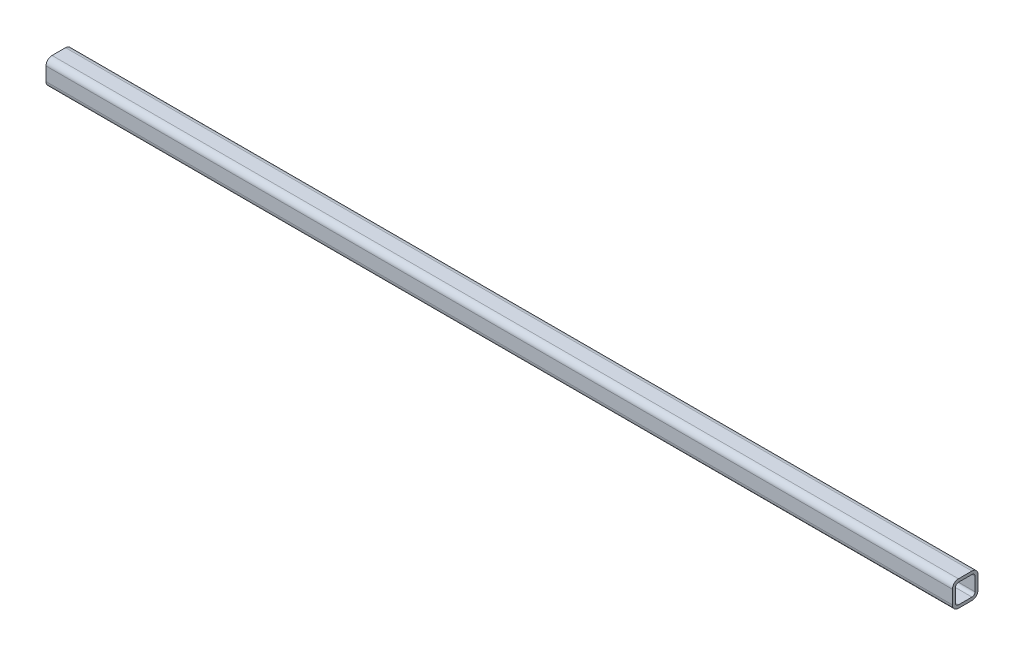
ISO-10303-21;
HEADER;
FILE_DESCRIPTION(('STEP AP214'),'2;1');
FILE_NAME('part.step','',(''),(''),'','','');
FILE_SCHEMA(('AUTOMOTIVE_DESIGN { 1 0 10303 214 1 1 1 1 }'));
ENDSEC;
DATA;
#1=APPLICATION_CONTEXT('core data for automotive mechanical design processes');
#2=APPLICATION_PROTOCOL_DEFINITION('international standard','automotive_design',2000,#1);
#3=PRODUCT_CONTEXT('',#1,'mechanical');
#4=PRODUCT('Part','Part','',(#3));
#5=PRODUCT_RELATED_PRODUCT_CATEGORY('part','',(#4));
#6=PRODUCT_DEFINITION_FORMATION('','',#4);
#7=PRODUCT_DEFINITION_CONTEXT('part definition',#1,'design');
#8=PRODUCT_DEFINITION('design','',#6,#7);
#9=PRODUCT_DEFINITION_SHAPE('','',#8);
#10=(LENGTH_UNIT() NAMED_UNIT(*) SI_UNIT(.MILLI.,.METRE.));
#11=(NAMED_UNIT(*) PLANE_ANGLE_UNIT() SI_UNIT($,.RADIAN.));
#12=(NAMED_UNIT(*) SI_UNIT($,.STERADIAN.) SOLID_ANGLE_UNIT());
#13=UNCERTAINTY_MEASURE_WITH_UNIT(LENGTH_MEASURE(1.E-05),#10,'distance_accuracy_value','');
#14=(GEOMETRIC_REPRESENTATION_CONTEXT(3) GLOBAL_UNCERTAINTY_ASSIGNED_CONTEXT((#13)) GLOBAL_UNIT_ASSIGNED_CONTEXT((#10,
#11,#12)) REPRESENTATION_CONTEXT('',''));
#15=CARTESIAN_POINT('',(0.,0.,0.));
#16=DIRECTION('',(0.,0.,1.));
#17=DIRECTION('',(1.,0.,0.));
#18=AXIS2_PLACEMENT_3D('',#15,#16,#17);
#19=CARTESIAN_POINT('',(900.,6.7,-6.7));
#20=DIRECTION('',(-1.,0.,0.));
#21=DIRECTION('',(0.,0.,1.));
#22=AXIS2_PLACEMENT_3D('',#19,#20,#21);
#23=CYLINDRICAL_SURFACE('',#22,6.);
#24=CARTESIAN_POINT('',(0.,6.7,-6.7));
#25=DIRECTION('',(1.,0.,0.));
#26=DIRECTION('',(0.,0.,-1.));
#27=AXIS2_PLACEMENT_3D('',#24,#25,#26);
#28=CIRCLE('',#27,6.);
#29=CARTESIAN_POINT('',(0.,6.7,-12.7));
#30=VERTEX_POINT('',#29);
#31=CARTESIAN_POINT('',(0.,12.7,-6.7));
#32=VERTEX_POINT('',#31);
#33=EDGE_CURVE('E234',#30,#32,#28,.T.);
#34=ORIENTED_EDGE('',*,*,#33,.T.);
#35=DIRECTION('',(-1.,0.,0.));
#36=VECTOR('',#35,1.);
#37=CARTESIAN_POINT('',(900.,12.7,-6.7));
#38=LINE('',#37,#36);
#39=CARTESIAN_POINT('',(900.,12.7,-6.7));
#40=VERTEX_POINT('',#39);
#41=EDGE_CURVE('E12',#40,#32,#38,.T.);
#42=ORIENTED_EDGE('',*,*,#41,.F.);
#43=CARTESIAN_POINT('',(900.,6.7,-6.7));
#44=DIRECTION('',(1.,0.,0.));
#45=DIRECTION('',(0.,0.,-1.));
#46=AXIS2_PLACEMENT_3D('',#43,#44,#45);
#47=CIRCLE('',#46,6.);
#48=CARTESIAN_POINT('',(900.,6.7,-12.7));
#49=VERTEX_POINT('',#48);
#50=EDGE_CURVE('E312',#49,#40,#47,.T.);
#51=ORIENTED_EDGE('',*,*,#50,.F.);
#52=DIRECTION('',(-1.,0.,0.));
#53=VECTOR('',#52,1.);
#54=CARTESIAN_POINT('',(900.,6.7,-12.7));
#55=LINE('',#54,#53);
#56=EDGE_CURVE('E249',#49,#30,#55,.T.);
#57=ORIENTED_EDGE('',*,*,#56,.T.);
#58=EDGE_LOOP('',(#34,#42,#51,#57));
#59=FACE_BOUND('',#58,.T.);
#60=ADVANCED_FACE('F62',(#59),#23,.T.);
#61=CARTESIAN_POINT('',(900.,12.7,-6.7));
#62=DIRECTION('',(0.,-1.,0.));
#63=DIRECTION('',(0.,0.,-1.));
#64=AXIS2_PLACEMENT_3D('',#61,#62,#63);
#65=PLANE('',#64);
#66=DIRECTION('',(0.,0.,1.));
#67=VECTOR('',#66,1.);
#68=CARTESIAN_POINT('',(0.,12.7,-6.7));
#69=LINE('',#68,#67);
#70=CARTESIAN_POINT('',(0.,12.7,6.7));
#71=VERTEX_POINT('',#70);
#72=EDGE_CURVE('E237',#32,#71,#69,.T.);
#73=ORIENTED_EDGE('',*,*,#72,.T.);
#74=DIRECTION('',(-1.,0.,0.));
#75=VECTOR('',#74,1.);
#76=CARTESIAN_POINT('',(900.,12.7,6.7));
#77=LINE('',#76,#75);
#78=CARTESIAN_POINT('',(900.,12.7,6.7));
#79=VERTEX_POINT('',#78);
#80=EDGE_CURVE('E72',#79,#71,#77,.T.);
#81=ORIENTED_EDGE('',*,*,#80,.F.);
#82=DIRECTION('',(0.,0.,1.));
#83=VECTOR('',#82,1.);
#84=CARTESIAN_POINT('',(900.,12.7,-6.7));
#85=LINE('',#84,#83);
#86=EDGE_CURVE('E314',#40,#79,#85,.T.);
#87=ORIENTED_EDGE('',*,*,#86,.F.);
#88=ORIENTED_EDGE('',*,*,#41,.T.);
#89=EDGE_LOOP('',(#73,#81,#87,#88));
#90=FACE_BOUND('',#89,.T.);
#91=ADVANCED_FACE('F349',(#90),#65,.F.);
#92=CARTESIAN_POINT('',(900.,6.7,6.7));
#93=DIRECTION('',(-1.,0.,0.));
#94=DIRECTION('',(0.,0.,1.));
#95=AXIS2_PLACEMENT_3D('',#92,#93,#94);
#96=CYLINDRICAL_SURFACE('',#95,6.);
#97=CARTESIAN_POINT('',(0.,6.7,6.7));
#98=DIRECTION('',(1.,0.,0.));
#99=DIRECTION('',(0.,0.,-1.));
#100=AXIS2_PLACEMENT_3D('',#97,#98,#99);
#101=CIRCLE('',#100,6.);
#102=CARTESIAN_POINT('',(0.,6.7,12.7));
#103=VERTEX_POINT('',#102);
#104=EDGE_CURVE('E239',#71,#103,#101,.T.);
#105=ORIENTED_EDGE('',*,*,#104,.T.);
#106=DIRECTION('',(-1.,0.,0.));
#107=VECTOR('',#106,1.);
#108=CARTESIAN_POINT('',(900.,6.7,12.7));
#109=LINE('',#108,#107);
#110=CARTESIAN_POINT('',(900.,6.7,12.7));
#111=VERTEX_POINT('',#110);
#112=EDGE_CURVE('E256',#111,#103,#109,.T.);
#113=ORIENTED_EDGE('',*,*,#112,.F.);
#114=CARTESIAN_POINT('',(900.,6.7,6.7));
#115=DIRECTION('',(1.,0.,0.));
#116=DIRECTION('',(0.,0.,-1.));
#117=AXIS2_PLACEMENT_3D('',#114,#115,#116);
#118=CIRCLE('',#117,6.);
#119=EDGE_CURVE('E316',#79,#111,#118,.T.);
#120=ORIENTED_EDGE('',*,*,#119,.F.);
#121=ORIENTED_EDGE('',*,*,#80,.T.);
#122=EDGE_LOOP('',(#105,#113,#120,#121));
#123=FACE_BOUND('',#122,.T.);
#124=ADVANCED_FACE('F354',(#123),#96,.T.);
#125=CARTESIAN_POINT('',(900.,-6.7,12.7));
#126=DIRECTION('',(0.,0.,-1.));
#127=DIRECTION('',(-1.,0.,0.));
#128=AXIS2_PLACEMENT_3D('',#125,#126,#127);
#129=PLANE('',#128);
#130=DIRECTION('',(0.,-1.,0.));
#131=VECTOR('',#130,1.);
#132=CARTESIAN_POINT('',(0.,-6.7,12.7));
#133=LINE('',#132,#131);
#134=CARTESIAN_POINT('',(0.,-6.7,12.7));
#135=VERTEX_POINT('',#134);
#136=EDGE_CURVE('E241',#103,#135,#133,.T.);
#137=ORIENTED_EDGE('',*,*,#136,.T.);
#138=DIRECTION('',(-1.,0.,0.));
#139=VECTOR('',#138,1.);
#140=CARTESIAN_POINT('',(900.,-6.7,12.7));
#141=LINE('',#140,#139);
#142=CARTESIAN_POINT('',(900.,-6.7,12.7));
#143=VERTEX_POINT('',#142);
#144=EDGE_CURVE('E253',#143,#135,#141,.T.);
#145=ORIENTED_EDGE('',*,*,#144,.F.);
#146=DIRECTION('',(0.,-1.,0.));
#147=VECTOR('',#146,1.);
#148=CARTESIAN_POINT('',(900.,-6.7,12.7));
#149=LINE('',#148,#147);
#150=EDGE_CURVE('E318',#111,#143,#149,.T.);
#151=ORIENTED_EDGE('',*,*,#150,.F.);
#152=ORIENTED_EDGE('',*,*,#112,.T.);
#153=EDGE_LOOP('',(#137,#145,#151,#152));
#154=FACE_BOUND('',#153,.T.);
#155=ADVANCED_FACE('F324',(#154),#129,.F.);
#156=CARTESIAN_POINT('',(900.,-6.7,6.7));
#157=DIRECTION('',(-1.,0.,0.));
#158=DIRECTION('',(0.,0.,1.));
#159=AXIS2_PLACEMENT_3D('',#156,#157,#158);
#160=CYLINDRICAL_SURFACE('',#159,6.);
#161=CARTESIAN_POINT('',(0.,-6.7,6.7));
#162=DIRECTION('',(1.,0.,0.));
#163=DIRECTION('',(0.,0.,-1.));
#164=AXIS2_PLACEMENT_3D('',#161,#162,#163);
#165=CIRCLE('',#164,6.);
#166=CARTESIAN_POINT('',(0.,-12.7,6.7));
#167=VERTEX_POINT('',#166);
#168=EDGE_CURVE('E243',#135,#167,#165,.T.);
#169=ORIENTED_EDGE('',*,*,#168,.T.);
#170=DIRECTION('',(-1.,0.,0.));
#171=VECTOR('',#170,1.);
#172=CARTESIAN_POINT('',(900.,-12.7,6.7));
#173=LINE('',#172,#171);
#174=CARTESIAN_POINT('',(900.,-12.7,6.7));
#175=VERTEX_POINT('',#174);
#176=EDGE_CURVE('E201',#175,#167,#173,.T.);
#177=ORIENTED_EDGE('',*,*,#176,.F.);
#178=CARTESIAN_POINT('',(900.,-6.7,6.7));
#179=DIRECTION('',(1.,0.,0.));
#180=DIRECTION('',(0.,0.,-1.));
#181=AXIS2_PLACEMENT_3D('',#178,#179,#180);
#182=CIRCLE('',#181,6.);
#183=EDGE_CURVE('E192',#143,#175,#182,.T.);
#184=ORIENTED_EDGE('',*,*,#183,.F.);
#185=ORIENTED_EDGE('',*,*,#144,.T.);
#186=EDGE_LOOP('',(#169,#177,#184,#185));
#187=FACE_BOUND('',#186,.T.);
#188=ADVANCED_FACE('F328',(#187),#160,.T.);
#189=CARTESIAN_POINT('',(900.,-12.7,6.7));
#190=DIRECTION('',(0.,1.,0.));
#191=DIRECTION('',(0.,0.,1.));
#192=AXIS2_PLACEMENT_3D('',#189,#190,#191);
#193=PLANE('',#192);
#194=DIRECTION('',(0.,0.,-1.));
#195=VECTOR('',#194,1.);
#196=CARTESIAN_POINT('',(0.,-12.7,6.7));
#197=LINE('',#196,#195);
#198=CARTESIAN_POINT('',(0.,-12.7,-6.7));
#199=VERTEX_POINT('',#198);
#200=EDGE_CURVE('E200',#167,#199,#197,.T.);
#201=ORIENTED_EDGE('',*,*,#200,.T.);
#202=DIRECTION('',(-1.,0.,0.));
#203=VECTOR('',#202,1.);
#204=CARTESIAN_POINT('',(900.,-12.7,-6.7));
#205=LINE('',#204,#203);
#206=CARTESIAN_POINT('',(900.,-12.7,-6.7));
#207=VERTEX_POINT('',#206);
#208=EDGE_CURVE('E197',#207,#199,#205,.T.);
#209=ORIENTED_EDGE('',*,*,#208,.F.);
#210=DIRECTION('',(0.,0.,-1.));
#211=VECTOR('',#210,1.);
#212=CARTESIAN_POINT('',(900.,-12.7,6.7));
#213=LINE('',#212,#211);
#214=EDGE_CURVE('E186',#175,#207,#213,.T.);
#215=ORIENTED_EDGE('',*,*,#214,.F.);
#216=ORIENTED_EDGE('',*,*,#176,.T.);
#217=EDGE_LOOP('',(#201,#209,#215,#216));
#218=FACE_BOUND('',#217,.T.);
#219=ADVANCED_FACE('F198',(#218),#193,.F.);
#220=CARTESIAN_POINT('',(900.,-6.7,-6.7));
#221=DIRECTION('',(-1.,0.,0.));
#222=DIRECTION('',(0.,0.,1.));
#223=AXIS2_PLACEMENT_3D('',#220,#221,#222);
#224=CYLINDRICAL_SURFACE('',#223,6.);
#225=CARTESIAN_POINT('',(0.,-6.7,-6.7));
#226=DIRECTION('',(1.,0.,0.));
#227=DIRECTION('',(0.,0.,-1.));
#228=AXIS2_PLACEMENT_3D('',#225,#226,#227);
#229=CIRCLE('',#228,6.);
#230=CARTESIAN_POINT('',(0.,-6.7,-12.7));
#231=VERTEX_POINT('',#230);
#232=EDGE_CURVE('E134',#199,#231,#229,.T.);
#233=ORIENTED_EDGE('',*,*,#232,.T.);
#234=DIRECTION('',(-1.,0.,0.));
#235=VECTOR('',#234,1.);
#236=CARTESIAN_POINT('',(900.,-6.7,-12.7));
#237=LINE('',#236,#235);
#238=CARTESIAN_POINT('',(900.,-6.7,-12.7));
#239=VERTEX_POINT('',#238);
#240=EDGE_CURVE('E202',#239,#231,#237,.T.);
#241=ORIENTED_EDGE('',*,*,#240,.F.);
#242=CARTESIAN_POINT('',(900.,-6.7,-6.7));
#243=DIRECTION('',(1.,0.,0.));
#244=DIRECTION('',(0.,0.,-1.));
#245=AXIS2_PLACEMENT_3D('',#242,#243,#244);
#246=CIRCLE('',#245,6.);
#247=EDGE_CURVE('E190',#207,#239,#246,.T.);
#248=ORIENTED_EDGE('',*,*,#247,.F.);
#249=ORIENTED_EDGE('',*,*,#208,.T.);
#250=EDGE_LOOP('',(#233,#241,#248,#249));
#251=FACE_BOUND('',#250,.T.);
#252=ADVANCED_FACE('F204',(#251),#224,.T.);
#253=CARTESIAN_POINT('',(900.,6.7,6.7));
#254=DIRECTION('',(-1.,0.,0.));
#255=DIRECTION('',(0.,0.,1.));
#256=AXIS2_PLACEMENT_3D('',#253,#254,#255);
#257=CYLINDRICAL_SURFACE('',#256,3.);
#258=CARTESIAN_POINT('',(0.,6.7,6.7));
#259=DIRECTION('',(1.,0.,0.));
#260=DIRECTION('',(0.,0.,-1.));
#261=AXIS2_PLACEMENT_3D('',#258,#259,#260);
#262=CIRCLE('',#261,3.);
#263=CARTESIAN_POINT('',(0.,9.7,6.7));
#264=VERTEX_POINT('',#263);
#265=CARTESIAN_POINT('',(0.,6.7,9.7));
#266=VERTEX_POINT('',#265);
#267=EDGE_CURVE('E210',#264,#266,#262,.T.);
#268=ORIENTED_EDGE('',*,*,#267,.F.);
#269=DIRECTION('',(-1.,0.,0.));
#270=VECTOR('',#269,1.);
#271=CARTESIAN_POINT('',(900.,9.7,6.7));
#272=LINE('',#271,#270);
#273=CARTESIAN_POINT('',(900.,9.7,6.7));
#274=VERTEX_POINT('',#273);
#275=EDGE_CURVE('E66',#274,#264,#272,.T.);
#276=ORIENTED_EDGE('',*,*,#275,.F.);
#277=CARTESIAN_POINT('',(900.,6.7,6.7));
#278=DIRECTION('',(1.,0.,0.));
#279=DIRECTION('',(0.,0.,-1.));
#280=AXIS2_PLACEMENT_3D('',#277,#278,#279);
#281=CIRCLE('',#280,3.);
#282=CARTESIAN_POINT('',(900.,6.7,9.7));
#283=VERTEX_POINT('',#282);
#284=EDGE_CURVE('E248',#274,#283,#281,.T.);
#285=ORIENTED_EDGE('',*,*,#284,.T.);
#286=DIRECTION('',(-1.,0.,0.));
#287=VECTOR('',#286,1.);
#288=CARTESIAN_POINT('',(900.,6.7,9.7));
#289=LINE('',#288,#287);
#290=EDGE_CURVE('E206',#283,#266,#289,.T.);
#291=ORIENTED_EDGE('',*,*,#290,.T.);
#292=EDGE_LOOP('',(#268,#276,#285,#291));
#293=FACE_BOUND('',#292,.T.);
#294=ADVANCED_FACE('F64',(#293),#257,.F.);
#295=CARTESIAN_POINT('',(900.,9.7,-6.7));
#296=DIRECTION('',(0.,-1.,0.));
#297=DIRECTION('',(0.,0.,-1.));
#298=AXIS2_PLACEMENT_3D('',#295,#296,#297);
#299=PLANE('',#298);
#300=DIRECTION('',(0.,0.,1.));
#301=VECTOR('',#300,1.);
#302=CARTESIAN_POINT('',(0.,9.7,-6.7));
#303=LINE('',#302,#301);
#304=CARTESIAN_POINT('',(0.,9.7,-6.7));
#305=VERTEX_POINT('',#304);
#306=EDGE_CURVE('E213',#305,#264,#303,.T.);
#307=ORIENTED_EDGE('',*,*,#306,.F.);
#308=DIRECTION('',(-1.,0.,0.));
#309=VECTOR('',#308,1.);
#310=CARTESIAN_POINT('',(900.,9.7,-6.7));
#311=LINE('',#310,#309);
#312=CARTESIAN_POINT('',(900.,9.7,-6.7));
#313=VERTEX_POINT('',#312);
#314=EDGE_CURVE('E271',#313,#305,#311,.T.);
#315=ORIENTED_EDGE('',*,*,#314,.F.);
#316=DIRECTION('',(0.,0.,1.));
#317=VECTOR('',#316,1.);
#318=CARTESIAN_POINT('',(900.,9.7,-6.7));
#319=LINE('',#318,#317);
#320=EDGE_CURVE('E280',#313,#274,#319,.T.);
#321=ORIENTED_EDGE('',*,*,#320,.T.);
#322=ORIENTED_EDGE('',*,*,#275,.T.);
#323=EDGE_LOOP('',(#307,#315,#321,#322));
#324=FACE_BOUND('',#323,.T.);
#325=ADVANCED_FACE('F278',(#324),#299,.T.);
#326=CARTESIAN_POINT('',(900.,6.7,-6.7));
#327=DIRECTION('',(-1.,0.,0.));
#328=DIRECTION('',(0.,0.,1.));
#329=AXIS2_PLACEMENT_3D('',#326,#327,#328);
#330=CYLINDRICAL_SURFACE('',#329,3.);
#331=CARTESIAN_POINT('',(0.,6.7,-6.7));
#332=DIRECTION('',(1.,0.,0.));
#333=DIRECTION('',(0.,0.,-1.));
#334=AXIS2_PLACEMENT_3D('',#331,#332,#333);
#335=CIRCLE('',#334,3.);
#336=CARTESIAN_POINT('',(0.,6.7,-9.7));
#337=VERTEX_POINT('',#336);
#338=EDGE_CURVE('E216',#337,#305,#335,.T.);
#339=ORIENTED_EDGE('',*,*,#338,.F.);
#340=DIRECTION('',(-1.,0.,0.));
#341=VECTOR('',#340,1.);
#342=CARTESIAN_POINT('',(900.,6.7,-9.7));
#343=LINE('',#342,#341);
#344=CARTESIAN_POINT('',(900.,6.7,-9.7));
#345=VERTEX_POINT('',#344);
#346=EDGE_CURVE('E270',#345,#337,#343,.T.);
#347=ORIENTED_EDGE('',*,*,#346,.F.);
#348=CARTESIAN_POINT('',(900.,6.7,-6.7));
#349=DIRECTION('',(1.,0.,0.));
#350=DIRECTION('',(0.,0.,-1.));
#351=AXIS2_PLACEMENT_3D('',#348,#349,#350);
#352=CIRCLE('',#351,3.);
#353=EDGE_CURVE('E288',#345,#313,#352,.T.);
#354=ORIENTED_EDGE('',*,*,#353,.T.);
#355=ORIENTED_EDGE('',*,*,#314,.T.);
#356=EDGE_LOOP('',(#339,#347,#354,#355));
#357=FACE_BOUND('',#356,.T.);
#358=ADVANCED_FACE('F286',(#357),#330,.F.);
#359=CARTESIAN_POINT('',(900.,6.7,-9.7));
#360=DIRECTION('',(0.,0.,1.));
#361=DIRECTION('',(1.,0.,0.));
#362=AXIS2_PLACEMENT_3D('',#359,#360,#361);
#363=PLANE('',#362);
#364=DIRECTION('',(0.,1.,0.));
#365=VECTOR('',#364,1.);
#366=CARTESIAN_POINT('',(0.,6.7,-9.7));
#367=LINE('',#366,#365);
#368=CARTESIAN_POINT('',(0.,-6.7,-9.7));
#369=VERTEX_POINT('',#368);
#370=EDGE_CURVE('E219',#369,#337,#367,.T.);
#371=ORIENTED_EDGE('',*,*,#370,.F.);
#372=DIRECTION('',(-1.,0.,0.));
#373=VECTOR('',#372,1.);
#374=CARTESIAN_POINT('',(900.,-6.7,-9.7));
#375=LINE('',#374,#373);
#376=CARTESIAN_POINT('',(900.,-6.7,-9.7));
#377=VERTEX_POINT('',#376);
#378=EDGE_CURVE('E268',#377,#369,#375,.T.);
#379=ORIENTED_EDGE('',*,*,#378,.F.);
#380=DIRECTION('',(0.,1.,0.));
#381=VECTOR('',#380,1.);
#382=CARTESIAN_POINT('',(900.,6.7,-9.7));
#383=LINE('',#382,#381);
#384=EDGE_CURVE('E294',#377,#345,#383,.T.);
#385=ORIENTED_EDGE('',*,*,#384,.T.);
#386=ORIENTED_EDGE('',*,*,#346,.T.);
#387=EDGE_LOOP('',(#371,#379,#385,#386));
#388=FACE_BOUND('',#387,.T.);
#389=ADVANCED_FACE('F297',(#388),#363,.T.);
#390=CARTESIAN_POINT('',(900.,-6.7,-6.7));
#391=DIRECTION('',(-1.,0.,0.));
#392=DIRECTION('',(0.,0.,1.));
#393=AXIS2_PLACEMENT_3D('',#390,#391,#392);
#394=CYLINDRICAL_SURFACE('',#393,3.);
#395=CARTESIAN_POINT('',(0.,-6.7,-6.7));
#396=DIRECTION('',(1.,0.,0.));
#397=DIRECTION('',(0.,0.,-1.));
#398=AXIS2_PLACEMENT_3D('',#395,#396,#397);
#399=CIRCLE('',#398,3.);
#400=CARTESIAN_POINT('',(0.,-9.7,-6.7));
#401=VERTEX_POINT('',#400);
#402=EDGE_CURVE('E222',#401,#369,#399,.T.);
#403=ORIENTED_EDGE('',*,*,#402,.F.);
#404=DIRECTION('',(-1.,0.,0.));
#405=VECTOR('',#404,1.);
#406=CARTESIAN_POINT('',(900.,-9.7,-6.7));
#407=LINE('',#406,#405);
#408=CARTESIAN_POINT('',(900.,-9.7,-6.7));
#409=VERTEX_POINT('',#408);
#410=EDGE_CURVE('E266',#409,#401,#407,.T.);
#411=ORIENTED_EDGE('',*,*,#410,.F.);
#412=CARTESIAN_POINT('',(900.,-6.7,-6.7));
#413=DIRECTION('',(1.,0.,0.));
#414=DIRECTION('',(0.,0.,-1.));
#415=AXIS2_PLACEMENT_3D('',#412,#413,#414);
#416=CIRCLE('',#415,3.);
#417=EDGE_CURVE('E298',#409,#377,#416,.T.);
#418=ORIENTED_EDGE('',*,*,#417,.T.);
#419=ORIENTED_EDGE('',*,*,#378,.T.);
#420=EDGE_LOOP('',(#403,#411,#418,#419));
#421=FACE_BOUND('',#420,.T.);
#422=ADVANCED_FACE('F365',(#421),#394,.F.);
#423=CARTESIAN_POINT('',(900.,-9.7,6.7));
#424=DIRECTION('',(0.,1.,0.));
#425=DIRECTION('',(0.,0.,1.));
#426=AXIS2_PLACEMENT_3D('',#423,#424,#425);
#427=PLANE('',#426);
#428=DIRECTION('',(0.,0.,-1.));
#429=VECTOR('',#428,1.);
#430=CARTESIAN_POINT('',(0.,-9.7,6.7));
#431=LINE('',#430,#429);
#432=CARTESIAN_POINT('',(0.,-9.7,6.7));
#433=VERTEX_POINT('',#432);
#434=EDGE_CURVE('E225',#433,#401,#431,.T.);
#435=ORIENTED_EDGE('',*,*,#434,.F.);
#436=DIRECTION('',(-1.,0.,0.));
#437=VECTOR('',#436,1.);
#438=CARTESIAN_POINT('',(900.,-9.7,6.7));
#439=LINE('',#438,#437);
#440=CARTESIAN_POINT('',(900.,-9.7,6.7));
#441=VERTEX_POINT('',#440);
#442=EDGE_CURVE('E264',#441,#433,#439,.T.);
#443=ORIENTED_EDGE('',*,*,#442,.F.);
#444=DIRECTION('',(0.,0.,-1.));
#445=VECTOR('',#444,1.);
#446=CARTESIAN_POINT('',(900.,-9.7,6.7));
#447=LINE('',#446,#445);
#448=EDGE_CURVE('E300',#441,#409,#447,.T.);
#449=ORIENTED_EDGE('',*,*,#448,.T.);
#450=ORIENTED_EDGE('',*,*,#410,.T.);
#451=EDGE_LOOP('',(#435,#443,#449,#450));
#452=FACE_BOUND('',#451,.T.);
#453=ADVANCED_FACE('F361',(#452),#427,.T.);
#454=CARTESIAN_POINT('',(900.,-6.7,6.7));
#455=DIRECTION('',(-1.,0.,0.));
#456=DIRECTION('',(0.,0.,1.));
#457=AXIS2_PLACEMENT_3D('',#454,#455,#456);
#458=CYLINDRICAL_SURFACE('',#457,3.);
#459=CARTESIAN_POINT('',(0.,-6.7,6.7));
#460=DIRECTION('',(1.,0.,0.));
#461=DIRECTION('',(0.,0.,-1.));
#462=AXIS2_PLACEMENT_3D('',#459,#460,#461);
#463=CIRCLE('',#462,3.);
#464=CARTESIAN_POINT('',(0.,-6.7,9.7));
#465=VERTEX_POINT('',#464);
#466=EDGE_CURVE('E228',#465,#433,#463,.T.);
#467=ORIENTED_EDGE('',*,*,#466,.F.);
#468=DIRECTION('',(-1.,0.,0.));
#469=VECTOR('',#468,1.);
#470=CARTESIAN_POINT('',(900.,-6.7,9.7));
#471=LINE('',#470,#469);
#472=CARTESIAN_POINT('',(900.,-6.7,9.7));
#473=VERTEX_POINT('',#472);
#474=EDGE_CURVE('E262',#473,#465,#471,.T.);
#475=ORIENTED_EDGE('',*,*,#474,.F.);
#476=CARTESIAN_POINT('',(900.,-6.7,6.7));
#477=DIRECTION('',(1.,0.,0.));
#478=DIRECTION('',(0.,0.,-1.));
#479=AXIS2_PLACEMENT_3D('',#476,#477,#478);
#480=CIRCLE('',#479,3.);
#481=EDGE_CURVE('E306',#473,#441,#480,.T.);
#482=ORIENTED_EDGE('',*,*,#481,.T.);
#483=ORIENTED_EDGE('',*,*,#442,.T.);
#484=EDGE_LOOP('',(#467,#475,#482,#483));
#485=FACE_BOUND('',#484,.T.);
#486=ADVANCED_FACE('F343',(#485),#458,.F.);
#487=CARTESIAN_POINT('',(900.,-6.7,9.7));
#488=DIRECTION('',(0.,0.,-1.));
#489=DIRECTION('',(-1.,0.,0.));
#490=AXIS2_PLACEMENT_3D('',#487,#488,#489);
#491=PLANE('',#490);
#492=DIRECTION('',(0.,-1.,0.));
#493=VECTOR('',#492,1.);
#494=CARTESIAN_POINT('',(0.,-6.7,9.7));
#495=LINE('',#494,#493);
#496=EDGE_CURVE('E231',#266,#465,#495,.T.);
#497=ORIENTED_EDGE('',*,*,#496,.F.);
#498=ORIENTED_EDGE('',*,*,#290,.F.);
#499=DIRECTION('',(0.,-1.,0.));
#500=VECTOR('',#499,1.);
#501=CARTESIAN_POINT('',(900.,-6.7,9.7));
#502=LINE('',#501,#500);
#503=EDGE_CURVE('E309',#283,#473,#502,.T.);
#504=ORIENTED_EDGE('',*,*,#503,.T.);
#505=ORIENTED_EDGE('',*,*,#474,.T.);
#506=EDGE_LOOP('',(#497,#498,#504,#505));
#507=FACE_BOUND('',#506,.T.);
#508=ADVANCED_FACE('F336',(#507),#491,.T.);
#509=CARTESIAN_POINT('',(900.,6.7,-12.7));
#510=DIRECTION('',(0.,0.,1.));
#511=DIRECTION('',(1.,0.,0.));
#512=AXIS2_PLACEMENT_3D('',#509,#510,#511);
#513=PLANE('',#512);
#514=DIRECTION('',(0.,1.,0.));
#515=VECTOR('',#514,1.);
#516=CARTESIAN_POINT('',(0.,6.7,-12.7));
#517=LINE('',#516,#515);
#518=EDGE_CURVE('E140',#231,#30,#517,.T.);
#519=ORIENTED_EDGE('',*,*,#518,.T.);
#520=ORIENTED_EDGE('',*,*,#56,.F.);
#521=DIRECTION('',(0.,1.,0.));
#522=VECTOR('',#521,1.);
#523=CARTESIAN_POINT('',(900.,6.7,-12.7));
#524=LINE('',#523,#522);
#525=EDGE_CURVE('E81',#239,#49,#524,.T.);
#526=ORIENTED_EDGE('',*,*,#525,.F.);
#527=ORIENTED_EDGE('',*,*,#240,.T.);
#528=EDGE_LOOP('',(#519,#520,#526,#527));
#529=FACE_BOUND('',#528,.T.);
#530=ADVANCED_FACE('F334',(#529),#513,.F.);
#531=CARTESIAN_POINT('',(900.,6.7,-6.7));
#532=DIRECTION('',(1.,0.,0.));
#533=DIRECTION('',(0.,0.,-1.));
#534=AXIS2_PLACEMENT_3D('',#531,#532,#533);
#535=PLANE('',#534);
#536=ORIENTED_EDGE('',*,*,#284,.F.);
#537=ORIENTED_EDGE('',*,*,#320,.F.);
#538=ORIENTED_EDGE('',*,*,#353,.F.);
#539=ORIENTED_EDGE('',*,*,#384,.F.);
#540=ORIENTED_EDGE('',*,*,#417,.F.);
#541=ORIENTED_EDGE('',*,*,#448,.F.);
#542=ORIENTED_EDGE('',*,*,#481,.F.);
#543=ORIENTED_EDGE('',*,*,#503,.F.);
#544=EDGE_LOOP('',(#536,#537,#538,#539,#540,#541,#542,#543));
#545=FACE_BOUND('',#544,.T.);
#546=ORIENTED_EDGE('',*,*,#50,.T.);
#547=ORIENTED_EDGE('',*,*,#86,.T.);
#548=ORIENTED_EDGE('',*,*,#119,.T.);
#549=ORIENTED_EDGE('',*,*,#150,.T.);
#550=ORIENTED_EDGE('',*,*,#183,.T.);
#551=ORIENTED_EDGE('',*,*,#214,.T.);
#552=ORIENTED_EDGE('',*,*,#247,.T.);
#553=ORIENTED_EDGE('',*,*,#525,.T.);
#554=EDGE_LOOP('',(#546,#547,#548,#549,#550,#551,#552,#553));
#555=FACE_BOUND('',#554,.T.);
#556=ADVANCED_FACE('F188',(#545,#555),#535,.T.);
#557=CARTESIAN_POINT('',(0.,6.7,-6.7));
#558=DIRECTION('',(1.,0.,0.));
#559=DIRECTION('',(0.,0.,-1.));
#560=AXIS2_PLACEMENT_3D('',#557,#558,#559);
#561=PLANE('',#560);
#562=ORIENTED_EDGE('',*,*,#267,.T.);
#563=ORIENTED_EDGE('',*,*,#496,.T.);
#564=ORIENTED_EDGE('',*,*,#466,.T.);
#565=ORIENTED_EDGE('',*,*,#434,.T.);
#566=ORIENTED_EDGE('',*,*,#402,.T.);
#567=ORIENTED_EDGE('',*,*,#370,.T.);
#568=ORIENTED_EDGE('',*,*,#338,.T.);
#569=ORIENTED_EDGE('',*,*,#306,.T.);
#570=EDGE_LOOP('',(#562,#563,#564,#565,#566,#567,#568,#569));
#571=FACE_BOUND('',#570,.T.);
#572=ORIENTED_EDGE('',*,*,#33,.F.);
#573=ORIENTED_EDGE('',*,*,#518,.F.);
#574=ORIENTED_EDGE('',*,*,#232,.F.);
#575=ORIENTED_EDGE('',*,*,#200,.F.);
#576=ORIENTED_EDGE('',*,*,#168,.F.);
#577=ORIENTED_EDGE('',*,*,#136,.F.);
#578=ORIENTED_EDGE('',*,*,#104,.F.);
#579=ORIENTED_EDGE('',*,*,#72,.F.);
#580=EDGE_LOOP('',(#572,#573,#574,#575,#576,#577,#578,#579));
#581=FACE_BOUND('',#580,.T.);
#582=ADVANCED_FACE('F283',(#571,#581),#561,.F.);
#583=CLOSED_SHELL('',(#60,#91,#124,#155,#188,#219,#252,#294,#325,#358,#389,#422,#453,#486,#508,
#530,#556,#582));
#584=MANIFOLD_SOLID_BREP('B2',#583);
#585=ADVANCED_BREP_SHAPE_REPRESENTATION('',(#18,#584),#14);
#586=SHAPE_DEFINITION_REPRESENTATION(#9,#585);
ENDSEC;
END-ISO-10303-21;
